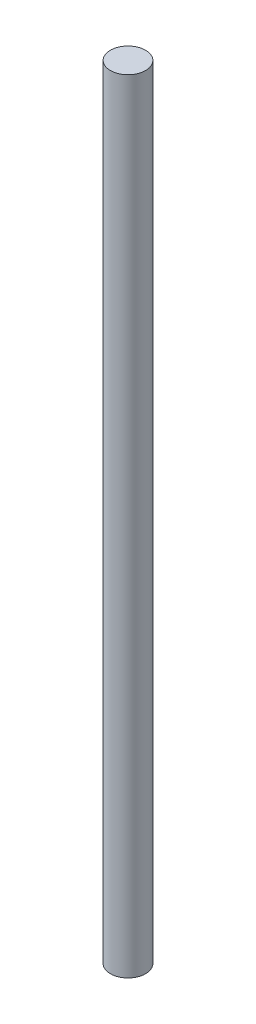
ISO-10303-21;
HEADER;
FILE_DESCRIPTION(('STEP AP214'),'2;1');
FILE_NAME('part.step','',(''),(''),'','','');
FILE_SCHEMA(('AUTOMOTIVE_DESIGN { 1 0 10303 214 1 1 1 1 }'));
ENDSEC;
DATA;
#1=APPLICATION_CONTEXT('core data for automotive mechanical design processes');
#2=APPLICATION_PROTOCOL_DEFINITION('international standard','automotive_design',2000,#1);
#3=PRODUCT_CONTEXT('',#1,'mechanical');
#4=PRODUCT('Part','Part','',(#3));
#5=PRODUCT_RELATED_PRODUCT_CATEGORY('part','',(#4));
#6=PRODUCT_DEFINITION_FORMATION('','',#4);
#7=PRODUCT_DEFINITION_CONTEXT('part definition',#1,'design');
#8=PRODUCT_DEFINITION('design','',#6,#7);
#9=PRODUCT_DEFINITION_SHAPE('','',#8);
#10=(LENGTH_UNIT() NAMED_UNIT(*) SI_UNIT(.MILLI.,.METRE.));
#11=(NAMED_UNIT(*) PLANE_ANGLE_UNIT() SI_UNIT($,.RADIAN.));
#12=(NAMED_UNIT(*) SI_UNIT($,.STERADIAN.) SOLID_ANGLE_UNIT());
#13=UNCERTAINTY_MEASURE_WITH_UNIT(LENGTH_MEASURE(1.E-05),#10,'distance_accuracy_value','');
#14=(GEOMETRIC_REPRESENTATION_CONTEXT(3) GLOBAL_UNCERTAINTY_ASSIGNED_CONTEXT((#13)) GLOBAL_UNIT_ASSIGNED_CONTEXT((#10,
#11,#12)) REPRESENTATION_CONTEXT('',''));
#15=CARTESIAN_POINT('',(0.,0.,0.));
#16=DIRECTION('',(0.,0.,1.));
#17=DIRECTION('',(1.,0.,0.));
#18=AXIS2_PLACEMENT_3D('',#15,#16,#17);
#19=CARTESIAN_POINT('',(0.,0.,0.));
#20=DIRECTION('',(0.,1.,0.));
#21=DIRECTION('',(0.,0.,1.));
#22=AXIS2_PLACEMENT_3D('',#19,#20,#21);
#23=PLANE('',#22);
#24=CARTESIAN_POINT('',(0.,0.,0.));
#25=DIRECTION('',(0.,1.,0.));
#26=DIRECTION('',(0.,0.,1.));
#27=AXIS2_PLACEMENT_3D('',#24,#25,#26);
#28=CIRCLE('',#27,6.75);
#29=CARTESIAN_POINT('',(0.,0.,6.75));
#30=VERTEX_POINT('',#29);
#31=EDGE_CURVE('E39',#30,#30,#28,.T.);
#32=ORIENTED_EDGE('',*,*,#31,.F.);
#33=EDGE_LOOP('',(#32));
#34=FACE_BOUND('',#33,.T.);
#35=ADVANCED_FACE('F32',(#34),#23,.F.);
#36=CARTESIAN_POINT('',(0.,300.,0.));
#37=DIRECTION('',(0.,1.,0.));
#38=DIRECTION('',(0.,0.,1.));
#39=AXIS2_PLACEMENT_3D('',#36,#37,#38);
#40=PLANE('',#39);
#41=CARTESIAN_POINT('',(0.,300.,0.));
#42=DIRECTION('',(0.,1.,0.));
#43=DIRECTION('',(0.,0.,1.));
#44=AXIS2_PLACEMENT_3D('',#41,#42,#43);
#45=CIRCLE('',#44,6.75);
#46=CARTESIAN_POINT('',(0.,300.,6.75));
#47=VERTEX_POINT('',#46);
#48=EDGE_CURVE('E11',#47,#47,#45,.T.);
#49=ORIENTED_EDGE('',*,*,#48,.T.);
#50=EDGE_LOOP('',(#49));
#51=FACE_BOUND('',#50,.T.);
#52=ADVANCED_FACE('F46',(#51),#40,.T.);
#53=CARTESIAN_POINT('',(0.,0.,0.));
#54=DIRECTION('',(0.,1.,0.));
#55=DIRECTION('',(0.,0.,1.));
#56=AXIS2_PLACEMENT_3D('',#53,#54,#55);
#57=CYLINDRICAL_SURFACE('',#56,6.75);
#58=ORIENTED_EDGE('',*,*,#48,.F.);
#59=EDGE_LOOP('',(#58));
#60=FACE_BOUND('',#59,.T.);
#61=ORIENTED_EDGE('',*,*,#31,.T.);
#62=EDGE_LOOP('',(#61));
#63=FACE_BOUND('',#62,.T.);
#64=ADVANCED_FACE('F48',(#60,#63),#57,.T.);
#65=CLOSED_SHELL('',(#35,#52,#64));
#66=MANIFOLD_SOLID_BREP('B2',#65);
#67=ADVANCED_BREP_SHAPE_REPRESENTATION('',(#18,#66),#14);
#68=SHAPE_DEFINITION_REPRESENTATION(#9,#67);
ENDSEC;
END-ISO-10303-21;
